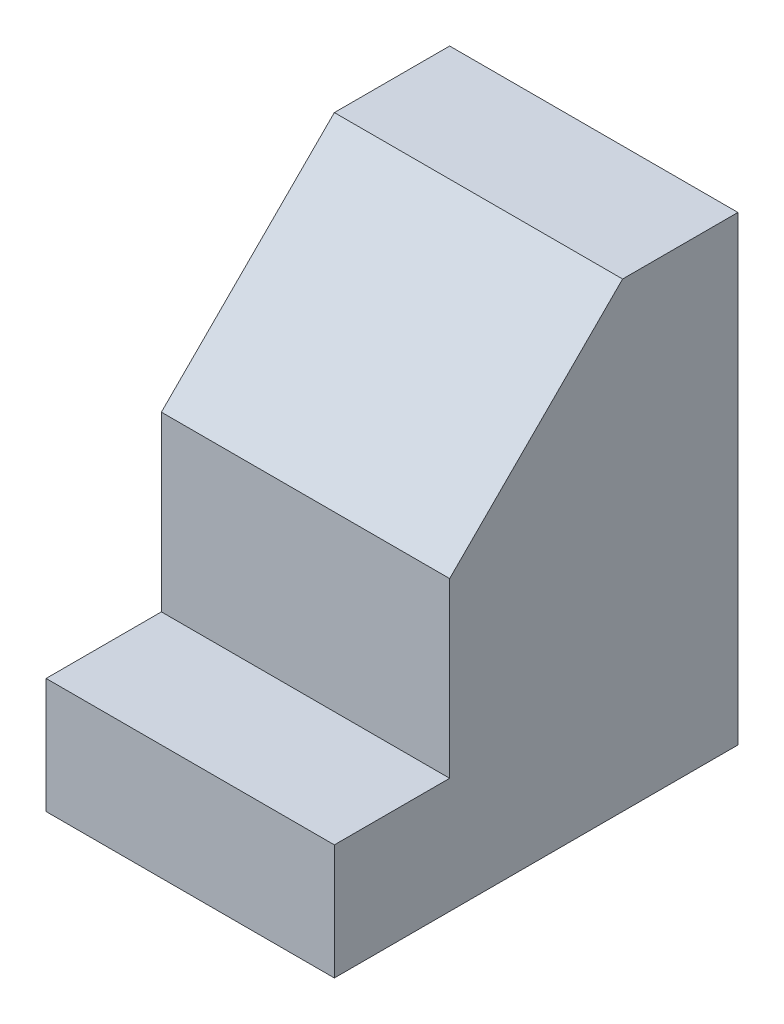
ISO-10303-21;
HEADER;
FILE_DESCRIPTION(('STEP AP214'),'2;1');
FILE_NAME('part.step','',(''),(''),'','','');
FILE_SCHEMA(('AUTOMOTIVE_DESIGN { 1 0 10303 214 1 1 1 1 }'));
ENDSEC;
DATA;
#1=APPLICATION_CONTEXT('core data for automotive mechanical design processes');
#2=APPLICATION_PROTOCOL_DEFINITION('international standard','automotive_design',2000,#1);
#3=PRODUCT_CONTEXT('',#1,'mechanical');
#4=PRODUCT('Part','Part','',(#3));
#5=PRODUCT_RELATED_PRODUCT_CATEGORY('part','',(#4));
#6=PRODUCT_DEFINITION_FORMATION('','',#4);
#7=PRODUCT_DEFINITION_CONTEXT('part definition',#1,'design');
#8=PRODUCT_DEFINITION('design','',#6,#7);
#9=PRODUCT_DEFINITION_SHAPE('','',#8);
#10=(LENGTH_UNIT() NAMED_UNIT(*) SI_UNIT(.MILLI.,.METRE.));
#11=(NAMED_UNIT(*) PLANE_ANGLE_UNIT() SI_UNIT($,.RADIAN.));
#12=(NAMED_UNIT(*) SI_UNIT($,.STERADIAN.) SOLID_ANGLE_UNIT());
#13=UNCERTAINTY_MEASURE_WITH_UNIT(LENGTH_MEASURE(1.E-05),#10,'distance_accuracy_value','');
#14=(GEOMETRIC_REPRESENTATION_CONTEXT(3) GLOBAL_UNCERTAINTY_ASSIGNED_CONTEXT((#13)) GLOBAL_UNIT_ASSIGNED_CONTEXT((#10,
#11,#12)) REPRESENTATION_CONTEXT('',''));
#15=CARTESIAN_POINT('',(0.,0.,0.));
#16=DIRECTION('',(0.,0.,1.));
#17=DIRECTION('',(1.,0.,0.));
#18=AXIS2_PLACEMENT_3D('',#15,#16,#17);
#19=CARTESIAN_POINT('',(-25000.,0.,-35000.));
#20=DIRECTION('',(0.,0.,-1.));
#21=DIRECTION('',(-1.,0.,0.));
#22=AXIS2_PLACEMENT_3D('',#19,#20,#21);
#23=PLANE('',#22);
#24=DIRECTION('',(0.,1.,0.));
#25=VECTOR('',#24,1.);
#26=CARTESIAN_POINT('',(0.,0.,-35000.));
#27=LINE('',#26,#25);
#28=CARTESIAN_POINT('',(0.,0.,-35000.));
#29=VERTEX_POINT('',#28);
#30=CARTESIAN_POINT('',(0.,40000.,-35000.));
#31=VERTEX_POINT('',#30);
#32=EDGE_CURVE('E150',#29,#31,#27,.T.);
#33=ORIENTED_EDGE('',*,*,#32,.F.);
#34=DIRECTION('',(1.,0.,0.));
#35=VECTOR('',#34,1.);
#36=CARTESIAN_POINT('',(-25000.,0.,-35000.));
#37=LINE('',#36,#35);
#38=CARTESIAN_POINT('',(-25000.,0.,-35000.));
#39=VERTEX_POINT('',#38);
#40=EDGE_CURVE('E131',#39,#29,#37,.T.);
#41=ORIENTED_EDGE('',*,*,#40,.F.);
#42=DIRECTION('',(0.,1.,0.));
#43=VECTOR('',#42,1.);
#44=CARTESIAN_POINT('',(-25000.,0.,-35000.));
#45=LINE('',#44,#43);
#46=CARTESIAN_POINT('',(-25000.,40000.,-35000.));
#47=VERTEX_POINT('',#46);
#48=EDGE_CURVE('E125',#39,#47,#45,.T.);
#49=ORIENTED_EDGE('',*,*,#48,.T.);
#50=DIRECTION('',(1.,0.,0.));
#51=VECTOR('',#50,1.);
#52=CARTESIAN_POINT('',(-25000.,40000.,-35000.));
#53=LINE('',#52,#51);
#54=EDGE_CURVE('E106',#47,#31,#53,.T.);
#55=ORIENTED_EDGE('',*,*,#54,.T.);
#56=EDGE_LOOP('',(#33,#41,#49,#55));
#57=FACE_BOUND('',#56,.T.);
#58=ADVANCED_FACE('F45',(#57),#23,.T.);
#59=CARTESIAN_POINT('',(-25000.,0.,0.));
#60=DIRECTION('',(0.,-1.,0.));
#61=DIRECTION('',(0.,0.,-1.));
#62=AXIS2_PLACEMENT_3D('',#59,#60,#61);
#63=PLANE('',#62);
#64=DIRECTION('',(0.,0.,-1.));
#65=VECTOR('',#64,1.);
#66=CARTESIAN_POINT('',(0.,0.,0.));
#67=LINE('',#66,#65);
#68=CARTESIAN_POINT('',(0.,0.,0.));
#69=VERTEX_POINT('',#68);
#70=EDGE_CURVE('E133',#69,#29,#67,.T.);
#71=ORIENTED_EDGE('',*,*,#70,.F.);
#72=DIRECTION('',(1.,0.,0.));
#73=VECTOR('',#72,1.);
#74=CARTESIAN_POINT('',(-25000.,0.,0.));
#75=LINE('',#74,#73);
#76=CARTESIAN_POINT('',(-25000.,0.,0.));
#77=VERTEX_POINT('',#76);
#78=EDGE_CURVE('E166',#77,#69,#75,.T.);
#79=ORIENTED_EDGE('',*,*,#78,.F.);
#80=DIRECTION('',(0.,0.,-1.));
#81=VECTOR('',#80,1.);
#82=CARTESIAN_POINT('',(-25000.,0.,0.));
#83=LINE('',#82,#81);
#84=EDGE_CURVE('E119',#77,#39,#83,.T.);
#85=ORIENTED_EDGE('',*,*,#84,.T.);
#86=ORIENTED_EDGE('',*,*,#40,.T.);
#87=EDGE_LOOP('',(#71,#79,#85,#86));
#88=FACE_BOUND('',#87,.T.);
#89=ADVANCED_FACE('F186',(#88),#63,.T.);
#90=CARTESIAN_POINT('',(-25000.,0.,0.));
#91=DIRECTION('',(0.,0.,-1.));
#92=DIRECTION('',(-1.,0.,0.));
#93=AXIS2_PLACEMENT_3D('',#90,#91,#92);
#94=PLANE('',#93);
#95=DIRECTION('',(0.,1.,0.));
#96=VECTOR('',#95,1.);
#97=CARTESIAN_POINT('',(0.,0.,0.));
#98=LINE('',#97,#96);
#99=CARTESIAN_POINT('',(0.,10000.,0.));
#100=VERTEX_POINT('',#99);
#101=EDGE_CURVE('E137',#69,#100,#98,.T.);
#102=ORIENTED_EDGE('',*,*,#101,.T.);
#103=DIRECTION('',(1.,0.,0.));
#104=VECTOR('',#103,1.);
#105=CARTESIAN_POINT('',(-25000.,10000.,0.));
#106=LINE('',#105,#104);
#107=CARTESIAN_POINT('',(-25000.,10000.,0.));
#108=VERTEX_POINT('',#107);
#109=EDGE_CURVE('E169',#108,#100,#106,.T.);
#110=ORIENTED_EDGE('',*,*,#109,.F.);
#111=DIRECTION('',(0.,1.,0.));
#112=VECTOR('',#111,1.);
#113=CARTESIAN_POINT('',(-25000.,0.,0.));
#114=LINE('',#113,#112);
#115=EDGE_CURVE('E145',#77,#108,#114,.T.);
#116=ORIENTED_EDGE('',*,*,#115,.F.);
#117=ORIENTED_EDGE('',*,*,#78,.T.);
#118=EDGE_LOOP('',(#102,#110,#116,#117));
#119=FACE_BOUND('',#118,.T.);
#120=ADVANCED_FACE('F192',(#119),#94,.F.);
#121=CARTESIAN_POINT('',(-25000.,10000.,0.));
#122=DIRECTION('',(0.,-1.,0.));
#123=DIRECTION('',(0.,0.,-1.));
#124=AXIS2_PLACEMENT_3D('',#121,#122,#123);
#125=PLANE('',#124);
#126=DIRECTION('',(0.,0.,-1.));
#127=VECTOR('',#126,1.);
#128=CARTESIAN_POINT('',(0.,10000.,0.));
#129=LINE('',#128,#127);
#130=CARTESIAN_POINT('',(0.,10000.,-10000.));
#131=VERTEX_POINT('',#130);
#132=EDGE_CURVE('E158',#100,#131,#129,.T.);
#133=ORIENTED_EDGE('',*,*,#132,.T.);
#134=DIRECTION('',(1.,0.,0.));
#135=VECTOR('',#134,1.);
#136=CARTESIAN_POINT('',(-25000.,10000.,-10000.));
#137=LINE('',#136,#135);
#138=CARTESIAN_POINT('',(-25000.,10000.,-10000.));
#139=VERTEX_POINT('',#138);
#140=EDGE_CURVE('E118',#139,#131,#137,.T.);
#141=ORIENTED_EDGE('',*,*,#140,.F.);
#142=DIRECTION('',(0.,0.,-1.));
#143=VECTOR('',#142,1.);
#144=CARTESIAN_POINT('',(-25000.,10000.,0.));
#145=LINE('',#144,#143);
#146=EDGE_CURVE('E142',#108,#139,#145,.T.);
#147=ORIENTED_EDGE('',*,*,#146,.F.);
#148=ORIENTED_EDGE('',*,*,#109,.T.);
#149=EDGE_LOOP('',(#133,#141,#147,#148));
#150=FACE_BOUND('',#149,.T.);
#151=ADVANCED_FACE('F194',(#150),#125,.F.);
#152=CARTESIAN_POINT('',(-25000.,10000.,-10000.));
#153=DIRECTION('',(0.,0.,-1.));
#154=DIRECTION('',(-1.,0.,0.));
#155=AXIS2_PLACEMENT_3D('',#152,#153,#154);
#156=PLANE('',#155);
#157=DIRECTION('',(0.,1.,0.));
#158=VECTOR('',#157,1.);
#159=CARTESIAN_POINT('',(0.,10000.,-10000.));
#160=LINE('',#159,#158);
#161=CARTESIAN_POINT('',(0.,24999.9999999999,-10000.));
#162=VERTEX_POINT('',#161);
#163=EDGE_CURVE('E155',#131,#162,#160,.T.);
#164=ORIENTED_EDGE('',*,*,#163,.T.);
#165=DIRECTION('',(-1.,0.,0.));
#166=VECTOR('',#165,1.);
#167=CARTESIAN_POINT('',(-25000.,24999.9999999999,-10000.));
#168=LINE('',#167,#166);
#169=CARTESIAN_POINT('',(-25000.,24999.9999999999,-10000.));
#170=VERTEX_POINT('',#169);
#171=EDGE_CURVE('E55',#162,#170,#168,.T.);
#172=ORIENTED_EDGE('',*,*,#171,.T.);
#173=DIRECTION('',(0.,1.,0.));
#174=VECTOR('',#173,1.);
#175=CARTESIAN_POINT('',(-25000.,10000.,-10000.));
#176=LINE('',#175,#174);
#177=EDGE_CURVE('E129',#139,#170,#176,.T.);
#178=ORIENTED_EDGE('',*,*,#177,.F.);
#179=ORIENTED_EDGE('',*,*,#140,.T.);
#180=EDGE_LOOP('',(#164,#172,#178,#179));
#181=FACE_BOUND('',#180,.T.);
#182=ADVANCED_FACE('F195',(#181),#156,.F.);
#183=CARTESIAN_POINT('',(-25000.,40000.,-35000.));
#184=DIRECTION('',(0.,1.,0.));
#185=DIRECTION('',(0.,0.,1.));
#186=AXIS2_PLACEMENT_3D('',#183,#184,#185);
#187=PLANE('',#186);
#188=DIRECTION('',(0.,0.,1.));
#189=VECTOR('',#188,1.);
#190=CARTESIAN_POINT('',(-25000.,40000.,-35000.));
#191=LINE('',#190,#189);
#192=CARTESIAN_POINT('',(-25000.,40000.,-25000.));
#193=VERTEX_POINT('',#192);
#194=EDGE_CURVE('E110',#47,#193,#191,.T.);
#195=ORIENTED_EDGE('',*,*,#194,.T.);
#196=DIRECTION('',(1.,0.,0.));
#197=VECTOR('',#196,1.);
#198=CARTESIAN_POINT('',(0.,40000.,-25000.));
#199=LINE('',#198,#197);
#200=CARTESIAN_POINT('',(0.,40000.,-25000.));
#201=VERTEX_POINT('',#200);
#202=EDGE_CURVE('E165',#193,#201,#199,.T.);
#203=ORIENTED_EDGE('',*,*,#202,.T.);
#204=DIRECTION('',(0.,0.,1.));
#205=VECTOR('',#204,1.);
#206=CARTESIAN_POINT('',(0.,40000.,-35000.));
#207=LINE('',#206,#205);
#208=EDGE_CURVE('E112',#31,#201,#207,.T.);
#209=ORIENTED_EDGE('',*,*,#208,.F.);
#210=ORIENTED_EDGE('',*,*,#54,.F.);
#211=EDGE_LOOP('',(#195,#203,#209,#210));
#212=FACE_BOUND('',#211,.T.);
#213=ADVANCED_FACE('F108',(#212),#187,.T.);
#214=CARTESIAN_POINT('',(-25000.,0.,0.));
#215=DIRECTION('',(1.,0.,0.));
#216=DIRECTION('',(0.,0.,-1.));
#217=AXIS2_PLACEMENT_3D('',#214,#215,#216);
#218=PLANE('',#217);
#219=ORIENTED_EDGE('',*,*,#177,.T.);
#220=DIRECTION('',(0.,0.707106781186549,-0.707106781186546));
#221=VECTOR('',#220,1.);
#222=CARTESIAN_POINT('',(-25000.,40000.,-25000.));
#223=LINE('',#222,#221);
#224=EDGE_CURVE('E11',#170,#193,#223,.T.);
#225=ORIENTED_EDGE('',*,*,#224,.T.);
#226=ORIENTED_EDGE('',*,*,#194,.F.);
#227=ORIENTED_EDGE('',*,*,#48,.F.);
#228=ORIENTED_EDGE('',*,*,#84,.F.);
#229=ORIENTED_EDGE('',*,*,#115,.T.);
#230=ORIENTED_EDGE('',*,*,#146,.T.);
#231=EDGE_LOOP('',(#219,#225,#226,#227,#228,#229,#230));
#232=FACE_BOUND('',#231,.T.);
#233=ADVANCED_FACE('F123',(#232),#218,.F.);
#234=CARTESIAN_POINT('',(0.,0.,0.));
#235=DIRECTION('',(1.,0.,0.));
#236=DIRECTION('',(0.,0.,-1.));
#237=AXIS2_PLACEMENT_3D('',#234,#235,#236);
#238=PLANE('',#237);
#239=ORIENTED_EDGE('',*,*,#208,.T.);
#240=DIRECTION('',(0.,-0.707106781186549,0.707106781186546));
#241=VECTOR('',#240,1.);
#242=CARTESIAN_POINT('',(0.,7499.99999999992,7499.99999999995));
#243=LINE('',#242,#241);
#244=EDGE_CURVE('E69',#201,#162,#243,.T.);
#245=ORIENTED_EDGE('',*,*,#244,.T.);
#246=ORIENTED_EDGE('',*,*,#163,.F.);
#247=ORIENTED_EDGE('',*,*,#132,.F.);
#248=ORIENTED_EDGE('',*,*,#101,.F.);
#249=ORIENTED_EDGE('',*,*,#70,.T.);
#250=ORIENTED_EDGE('',*,*,#32,.T.);
#251=EDGE_LOOP('',(#239,#245,#246,#247,#248,#249,#250));
#252=FACE_BOUND('',#251,.T.);
#253=ADVANCED_FACE('F181',(#252),#238,.T.);
#254=CARTESIAN_POINT('',(-25000.,40000.,-25000.));
#255=DIRECTION('',(0.,0.707106781186546,0.707106781186549));
#256=DIRECTION('',(-1.,0.,0.));
#257=AXIS2_PLACEMENT_3D('',#254,#255,#256);
#258=PLANE('',#257);
#259=ORIENTED_EDGE('',*,*,#224,.F.);
#260=ORIENTED_EDGE('',*,*,#171,.F.);
#261=ORIENTED_EDGE('',*,*,#244,.F.);
#262=ORIENTED_EDGE('',*,*,#202,.F.);
#263=EDGE_LOOP('',(#259,#260,#261,#262));
#264=FACE_BOUND('',#263,.T.);
#265=ADVANCED_FACE('F48',(#264),#258,.T.);
#266=CLOSED_SHELL('',(#58,#89,#120,#151,#182,#213,#233,#253,#265));
#267=MANIFOLD_SOLID_BREP('B2',#266);
#268=ADVANCED_BREP_SHAPE_REPRESENTATION('',(#18,#267),#14);
#269=SHAPE_DEFINITION_REPRESENTATION(#9,#268);
ENDSEC;
END-ISO-10303-21;
